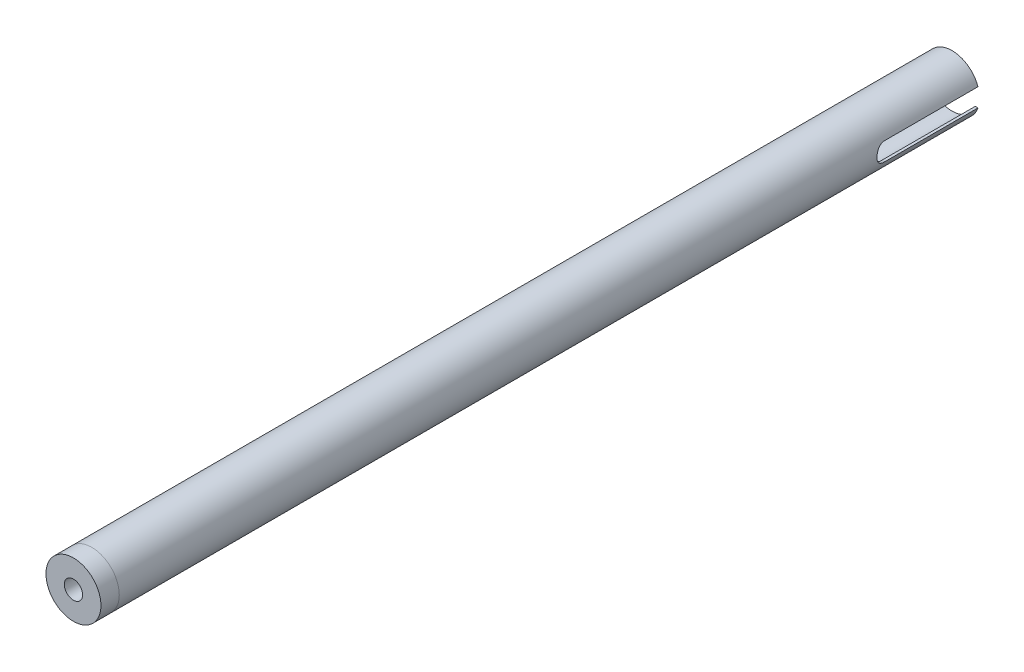
ISO-10303-21;
HEADER;
FILE_DESCRIPTION(('STEP AP214'),'2;1');
FILE_NAME('part.step','',(''),(''),'','','');
FILE_SCHEMA(('AUTOMOTIVE_DESIGN { 1 0 10303 214 1 1 1 1 }'));
ENDSEC;
DATA;
#1=APPLICATION_CONTEXT('core data for automotive mechanical design processes');
#2=APPLICATION_PROTOCOL_DEFINITION('international standard','automotive_design',2000,#1);
#3=PRODUCT_CONTEXT('',#1,'mechanical');
#4=PRODUCT('Part','Part','',(#3));
#5=PRODUCT_RELATED_PRODUCT_CATEGORY('part','',(#4));
#6=PRODUCT_DEFINITION_FORMATION('','',#4);
#7=PRODUCT_DEFINITION_CONTEXT('part definition',#1,'design');
#8=PRODUCT_DEFINITION('design','',#6,#7);
#9=PRODUCT_DEFINITION_SHAPE('','',#8);
#10=(LENGTH_UNIT() NAMED_UNIT(*) SI_UNIT(.MILLI.,.METRE.));
#11=(NAMED_UNIT(*) PLANE_ANGLE_UNIT() SI_UNIT($,.RADIAN.));
#12=(NAMED_UNIT(*) SI_UNIT($,.STERADIAN.) SOLID_ANGLE_UNIT());
#13=UNCERTAINTY_MEASURE_WITH_UNIT(LENGTH_MEASURE(1.E-05),#10,'distance_accuracy_value','');
#14=(GEOMETRIC_REPRESENTATION_CONTEXT(3) GLOBAL_UNCERTAINTY_ASSIGNED_CONTEXT((#13)) GLOBAL_UNIT_ASSIGNED_CONTEXT((#10,
#11,#12)) REPRESENTATION_CONTEXT('',''));
#15=CARTESIAN_POINT('',(0.,0.,0.));
#16=DIRECTION('',(0.,0.,1.));
#17=DIRECTION('',(1.,0.,0.));
#18=AXIS2_PLACEMENT_3D('',#15,#16,#17);
#19=CARTESIAN_POINT('',(0.,0.,-304.380065838685));
#20=DIRECTION('',(0.,0.,1.));
#21=DIRECTION('',(1.,0.,0.));
#22=AXIS2_PLACEMENT_3D('',#19,#20,#21);
#23=CYLINDRICAL_SURFACE('',#22,9.525);
#24=CARTESIAN_POINT('',(0.,0.,-6.35));
#25=DIRECTION('',(0.,0.,1.));
#26=DIRECTION('',(1.,0.,0.));
#27=AXIS2_PLACEMENT_3D('',#24,#25,#26);
#28=CIRCLE('',#27,9.525);
#29=CARTESIAN_POINT('',(9.525,0.,-6.35));
#30=VERTEX_POINT('',#29);
#31=EDGE_CURVE('E167',#30,#30,#28,.T.);
#32=ORIENTED_EDGE('',*,*,#31,.F.);
#33=EDGE_LOOP('',(#32));
#34=FACE_BOUND('',#33,.T.);
#35=CARTESIAN_POINT('',(-8.98025612106915,3.175,-271.995065838685));
#36=CARTESIAN_POINT('',(-8.98024230233901,3.17501142134308,-271.908439735349));
#37=CARTESIAN_POINT('',(-8.98150922759707,3.17145501317748,-271.821821352873));
#38=CARTESIAN_POINT('',(-8.98650170400112,3.1572955094353,-271.649256538048));
#39=CARTESIAN_POINT('',(-8.99022659113085,3.14669431699564,-271.563309930562));
#40=CARTESIAN_POINT('',(-9.00001740508998,3.11857670914845,-271.392955689397));
#41=CARTESIAN_POINT('',(-9.00607621805003,3.10108130380328,-271.30854418759));
#42=CARTESIAN_POINT('',(-9.02033586435304,3.05935434973543,-271.141609386254));
#43=CARTESIAN_POINT('',(-9.02853677497232,3.03512255799513,-271.059086154963));
#44=CARTESIAN_POINT('',(-9.05598792154067,2.95264369348964,-270.815287531686));
#45=CARTESIAN_POINT('',(-9.07810200713862,2.88457148458964,-270.657533947362));
#46=CARTESIAN_POINT('',(-9.127451360236,2.72437908867648,-270.355657428873));
#47=CARTESIAN_POINT('',(-9.15468995097455,2.63224328129309,-270.211543431645));
#48=CARTESIAN_POINT('',(-9.21240416673121,2.42269155952415,-269.93539057182));
#49=CARTESIAN_POINT('',(-9.24296008478943,2.30449853156514,-269.803956989958));
#50=CARTESIAN_POINT('',(-9.30318902123142,2.04784031127147,-269.562361693621));
#51=CARTESIAN_POINT('',(-9.33286185998227,1.90937102786997,-269.452204282389));
#52=CARTESIAN_POINT('',(-9.38892492365177,1.61159672697581,-269.253487270901));
#53=CARTESIAN_POINT('',(-9.41520772598946,1.45183792838573,-269.165575084891));
#54=CARTESIAN_POINT('',(-9.46054712430068,1.11883883316166,-269.018170358821));
#55=CARTESIAN_POINT('',(-9.47961052807859,0.945611424033788,-268.95865103082));
#56=CARTESIAN_POINT('',(-9.50410661247238,0.642992499572375,-268.883172266324));
#57=CARTESIAN_POINT('',(-9.51189798251809,0.515662964136016,-268.859554294281));
#58=CARTESIAN_POINT('',(-9.51973491912187,0.323120458247701,-268.835888028107));
#59=CARTESIAN_POINT('',(-9.52170555244691,0.258670486244991,-268.829959380491));
#60=CARTESIAN_POINT('',(-9.52433958502699,0.12948493034666,-268.822046755824));
#61=CARTESIAN_POINT('',(-9.5250026318504,0.0647492741617728,-268.820063842259));
#62=CARTESIAN_POINT('',(-9.525,0.,-268.820065838685));
#63=B_SPLINE_CURVE_WITH_KNOTS('',3,(#35,#36,#37,#38,#39,#40,#41,#42,#43,#44,#45,#46,#47,#48,#49,
#50,#51,#52,#53,#54,#55,#56,#57,#58,#59,#60,#61,#62),.UNSPECIFIED.,.F.,.F.,(4,2,2,2,2,2,2,2,2,2,
2,2,2,4),(0.,0.259783027985017,0.519495904525443,0.778423354079467,1.0373601457496,
1.55448370709133,2.07194378605916,2.60765740005743,3.14347925237348,3.69345572792671,
4.24291228331228,4.63105001394513,4.82518498412947,5.01937227204625),.UNSPECIFIED.);
#64=CARTESIAN_POINT('',(-8.98025612106915,3.175,-271.995065838685));
#65=VERTEX_POINT('',#64);
#66=CARTESIAN_POINT('',(-9.525,0.,-268.820065838685));
#67=VERTEX_POINT('',#66);
#68=EDGE_CURVE('E194',#65,#67,#63,.T.);
#69=ORIENTED_EDGE('',*,*,#68,.T.);
#70=CARTESIAN_POINT('',(-9.525,0.,-268.820065838685));
#71=CARTESIAN_POINT('',(-9.52501110102584,-0.0867614879611049,-268.820054733648));
#72=CARTESIAN_POINT('',(-9.52381482114642,-0.173516026970688,-268.823621945305));
#73=CARTESIAN_POINT('',(-9.51909010104991,-0.346361025979108,-268.837826783887));
#74=CARTESIAN_POINT('',(-9.51556219632442,-0.432451633867625,-268.848462787364));
#75=CARTESIAN_POINT('',(-9.50626969526085,-0.603121388983434,-268.876679778878));
#76=CARTESIAN_POINT('',(-9.50051134567603,-0.687704073408645,-268.894241373046));
#77=CARTESIAN_POINT('',(-9.48692170416637,-0.854983898510573,-268.936132693684));
#78=CARTESIAN_POINT('',(-9.47909035815865,-0.937680989932473,-268.960462596734));
#79=CARTESIAN_POINT('',(-9.45278540829331,-1.18202731628102,-269.043296989672));
#80=CARTESIAN_POINT('',(-9.43148823554423,-1.3401498669332,-269.111682671018));
#81=CARTESIAN_POINT('',(-9.38354405256208,-1.64264414222568,-269.272609196794));
#82=CARTESIAN_POINT('',(-9.35689419571071,-1.78700848960572,-269.365162901948));
#83=CARTESIAN_POINT('',(-9.30002401422067,-2.06291632995428,-269.575156330153));
#84=CARTESIAN_POINT('',(-9.26971861159363,-2.19392359690275,-269.693278615572));
#85=CARTESIAN_POINT('',(-9.20941732427212,-2.43468689521899,-269.949616592407));
#86=CARTESIAN_POINT('',(-9.1794215361322,-2.54443647619593,-270.087838360565));
#87=CARTESIAN_POINT('',(-9.122187697517,-2.74268087840455,-270.385346339613));
#88=CARTESIAN_POINT('',(-9.09505529775998,-2.83046425019681,-270.545128477686));
#89=CARTESIAN_POINT('',(-9.04794936227173,-2.9776233718293,-270.878172799691));
#90=CARTESIAN_POINT('',(-9.0279682579705,-3.03702917747985,-271.051420494499));
#91=CARTESIAN_POINT('',(-9.00226999890487,-3.1122125650425,-271.353707528494));
#92=CARTESIAN_POINT('',(-8.99408207355733,-3.13569679171672,-271.480669849921));
#93=CARTESIAN_POINT('',(-8.98304472933549,-3.16711304593222,-271.73674702169));
#94=CARTESIAN_POINT('',(-8.98019613476149,-3.17504267212105,-271.865862201292));
#95=CARTESIAN_POINT('',(-8.98025612106915,-3.175,-271.995065838685));
#96=B_SPLINE_CURVE_WITH_KNOTS('',3,(#70,#71,#72,#73,#74,#75,#76,#77,#78,#79,#80,#81,#82,#83,#84,
#85,#86,#87,#88,#89,#90,#91,#92,#93,#94,#95),.UNSPECIFIED.,.F.,.F.,(4,2,2,2,2,2,2,2,2,2,2,2,4),
(0.,0.260191091827307,0.52032244773723,0.77973046721251,1.03914525511038,1.55731822615721,
2.07576750062865,2.61028978360824,3.14497400776474,3.6952175213376,4.24487695078963,
4.63199348452988,5.01916977744542),.UNSPECIFIED.);
#97=CARTESIAN_POINT('',(-8.98025612106916,-3.175,-271.995065838685));
#98=VERTEX_POINT('',#97);
#99=EDGE_CURVE('E146',#67,#98,#96,.T.);
#100=ORIENTED_EDGE('',*,*,#99,.T.);
#101=DIRECTION('',(0.,0.,-1.));
#102=VECTOR('',#101,1.);
#103=CARTESIAN_POINT('',(-8.98025612106916,-3.175,-268.820065838685));
#104=LINE('',#103,#102);
#105=CARTESIAN_POINT('',(-8.98025612106916,-3.175,-304.380065838685));
#106=VERTEX_POINT('',#105);
#107=EDGE_CURVE('E141',#98,#106,#104,.T.);
#108=ORIENTED_EDGE('',*,*,#107,.T.);
#109=CARTESIAN_POINT('',(0.,0.,-304.380065838685));
#110=DIRECTION('',(0.,0.,1.));
#111=DIRECTION('',(1.,0.,0.));
#112=AXIS2_PLACEMENT_3D('',#109,#110,#111);
#113=CIRCLE('',#112,9.525);
#114=CARTESIAN_POINT('',(8.98025612106915,-3.175,-304.380065838685));
#115=VERTEX_POINT('',#114);
#116=EDGE_CURVE('E144',#106,#115,#113,.T.);
#117=ORIENTED_EDGE('',*,*,#116,.T.);
#118=DIRECTION('',(0.,0.,-1.));
#119=VECTOR('',#118,1.);
#120=CARTESIAN_POINT('',(8.98025612106915,-3.175,-268.820065838685));
#121=LINE('',#120,#119);
#122=CARTESIAN_POINT('',(8.98025612106915,-3.175,-271.995065838685));
#123=VERTEX_POINT('',#122);
#124=EDGE_CURVE('E427',#123,#115,#121,.T.);
#125=ORIENTED_EDGE('',*,*,#124,.F.);
#126=CARTESIAN_POINT('',(8.98025612106915,-3.175,-271.995065838685));
#127=CARTESIAN_POINT('',(8.98024230233901,-3.17501142134308,-271.908439735349));
#128=CARTESIAN_POINT('',(8.98150922759707,-3.17145501317748,-271.821821352873));
#129=CARTESIAN_POINT('',(8.98650170400112,-3.1572955094353,-271.649256538048));
#130=CARTESIAN_POINT('',(8.99022659113085,-3.14669431699564,-271.563309930562));
#131=CARTESIAN_POINT('',(9.00001740508998,-3.11857670914845,-271.392955689397));
#132=CARTESIAN_POINT('',(9.00607621805003,-3.10108130380328,-271.30854418759));
#133=CARTESIAN_POINT('',(9.02033586435304,-3.05935434973543,-271.141609386254));
#134=CARTESIAN_POINT('',(9.02853677497232,-3.03512255799513,-271.059086154963));
#135=CARTESIAN_POINT('',(9.05598792154067,-2.95264369348964,-270.815287531686));
#136=CARTESIAN_POINT('',(9.07810200713862,-2.88457148458964,-270.657533947362));
#137=CARTESIAN_POINT('',(9.127451360236,-2.72437908867648,-270.355657428873));
#138=CARTESIAN_POINT('',(9.15468995097455,-2.63224328129309,-270.211543431645));
#139=CARTESIAN_POINT('',(9.21240416673121,-2.42269155952415,-269.93539057182));
#140=CARTESIAN_POINT('',(9.24296008478943,-2.30449853156514,-269.803956989958));
#141=CARTESIAN_POINT('',(9.30318902123142,-2.04784031127147,-269.562361693621));
#142=CARTESIAN_POINT('',(9.33286185998227,-1.90937102786997,-269.452204282389));
#143=CARTESIAN_POINT('',(9.38892492365177,-1.61159672697581,-269.253487270901));
#144=CARTESIAN_POINT('',(9.41520772598946,-1.45183792838573,-269.165575084891));
#145=CARTESIAN_POINT('',(9.46054712430068,-1.11883883316166,-269.018170358821));
#146=CARTESIAN_POINT('',(9.47961052807859,-0.945611424033788,-268.95865103082));
#147=CARTESIAN_POINT('',(9.50410661247238,-0.642992499572375,-268.883172266324));
#148=CARTESIAN_POINT('',(9.51189798251809,-0.515662964136016,-268.859554294281));
#149=CARTESIAN_POINT('',(9.51973491912187,-0.323120458247701,-268.835888028107));
#150=CARTESIAN_POINT('',(9.52170555244691,-0.258670486244991,-268.829959380491));
#151=CARTESIAN_POINT('',(9.52433958502699,-0.12948493034666,-268.822046755824));
#152=CARTESIAN_POINT('',(9.5250026318504,-0.0647492741617728,-268.820063842259));
#153=CARTESIAN_POINT('',(9.525,0.,-268.820065838685));
#154=B_SPLINE_CURVE_WITH_KNOTS('',3,(#126,#127,#128,#129,#130,#131,#132,#133,#134,#135,#136,
#137,#138,#139,#140,#141,#142,#143,#144,#145,#146,#147,#148,#149,#150,#151,#152,#153),
.UNSPECIFIED.,.F.,.F.,(4,2,2,2,2,2,2,2,2,2,2,2,2,4),(0.,0.259783027985017,0.519495904525443,
0.778423354079467,1.0373601457496,1.55448370709133,2.07194378605916,2.60765740005743,
3.14347925237348,3.69345572792671,4.24291228331228,4.63105001394513,4.82518498412947,
5.01937227204625),.UNSPECIFIED.);
#155=CARTESIAN_POINT('',(9.525,0.,-268.820065838685));
#156=VERTEX_POINT('',#155);
#157=EDGE_CURVE('E87',#123,#156,#154,.T.);
#158=ORIENTED_EDGE('',*,*,#157,.T.);
#159=CARTESIAN_POINT('',(9.525,0.,-268.820065838685));
#160=CARTESIAN_POINT('',(9.52501110102584,0.0867614879611049,-268.820054733648));
#161=CARTESIAN_POINT('',(9.52381482114642,0.173516026970688,-268.823621945305));
#162=CARTESIAN_POINT('',(9.51909010104991,0.346361025979108,-268.837826783887));
#163=CARTESIAN_POINT('',(9.51556219632442,0.432451633867625,-268.848462787364));
#164=CARTESIAN_POINT('',(9.50626969526085,0.603121388983434,-268.876679778878));
#165=CARTESIAN_POINT('',(9.50051134567603,0.687704073408645,-268.894241373046));
#166=CARTESIAN_POINT('',(9.48692170416637,0.854983898510573,-268.936132693684));
#167=CARTESIAN_POINT('',(9.47909035815865,0.937680989932473,-268.960462596734));
#168=CARTESIAN_POINT('',(9.45278540829331,1.18202731628102,-269.043296989672));
#169=CARTESIAN_POINT('',(9.43148823554423,1.3401498669332,-269.111682671018));
#170=CARTESIAN_POINT('',(9.38354405256208,1.64264414222568,-269.272609196794));
#171=CARTESIAN_POINT('',(9.35689419571071,1.78700848960572,-269.365162901948));
#172=CARTESIAN_POINT('',(9.30002401422067,2.06291632995428,-269.575156330153));
#173=CARTESIAN_POINT('',(9.26971861159363,2.19392359690275,-269.693278615572));
#174=CARTESIAN_POINT('',(9.20941732427212,2.43468689521899,-269.949616592407));
#175=CARTESIAN_POINT('',(9.1794215361322,2.54443647619593,-270.087838360565));
#176=CARTESIAN_POINT('',(9.122187697517,2.74268087840455,-270.385346339613));
#177=CARTESIAN_POINT('',(9.09505529775998,2.83046425019681,-270.545128477686));
#178=CARTESIAN_POINT('',(9.04794936227173,2.9776233718293,-270.878172799691));
#179=CARTESIAN_POINT('',(9.0279682579705,3.03702917747985,-271.051420494499));
#180=CARTESIAN_POINT('',(9.00226999890487,3.1122125650425,-271.353707528494));
#181=CARTESIAN_POINT('',(8.99408207355733,3.13569679171672,-271.480669849921));
#182=CARTESIAN_POINT('',(8.98304472933549,3.16711304593222,-271.73674702169));
#183=CARTESIAN_POINT('',(8.98019613476149,3.17504267212105,-271.865862201292));
#184=CARTESIAN_POINT('',(8.98025612106915,3.175,-271.995065838685));
#185=B_SPLINE_CURVE_WITH_KNOTS('',3,(#159,#160,#161,#162,#163,#164,#165,#166,#167,#168,#169,
#170,#171,#172,#173,#174,#175,#176,#177,#178,#179,#180,#181,#182,#183,#184),.UNSPECIFIED.,.F.,
.F.,(4,2,2,2,2,2,2,2,2,2,2,2,4),(0.,0.260191091827307,0.52032244773723,0.77973046721251,
1.03914525511038,1.55731822615721,2.07576750062865,2.61028978360824,3.14497400776474,
3.6952175213376,4.24487695078963,4.63199348452988,5.01916977744542),.UNSPECIFIED.);
#186=CARTESIAN_POINT('',(8.98025612106915,3.175,-271.995065838685));
#187=VERTEX_POINT('',#186);
#188=EDGE_CURVE('E73',#156,#187,#185,.T.);
#189=ORIENTED_EDGE('',*,*,#188,.T.);
#190=DIRECTION('',(0.,0.,-1.));
#191=VECTOR('',#190,1.);
#192=CARTESIAN_POINT('',(8.98025612106915,3.175,-268.820065838685));
#193=LINE('',#192,#191);
#194=CARTESIAN_POINT('',(8.98025612106915,3.175,-304.380065838685));
#195=VERTEX_POINT('',#194);
#196=EDGE_CURVE('E160',#187,#195,#193,.T.);
#197=ORIENTED_EDGE('',*,*,#196,.T.);
#198=CARTESIAN_POINT('',(-8.98025612106915,3.175,-304.380065838685));
#199=VERTEX_POINT('',#198);
#200=EDGE_CURVE('E166',#195,#199,#113,.T.);
#201=ORIENTED_EDGE('',*,*,#200,.T.);
#202=DIRECTION('',(0.,0.,-1.));
#203=VECTOR('',#202,1.);
#204=CARTESIAN_POINT('',(-8.98025612106915,3.175,-268.820065838685));
#205=LINE('',#204,#203);
#206=EDGE_CURVE('E420',#65,#199,#205,.T.);
#207=ORIENTED_EDGE('',*,*,#206,.F.);
#208=EDGE_LOOP('',(#69,#100,#108,#117,#125,#158,#189,#197,#201,#207));
#209=FACE_BOUND('',#208,.T.);
#210=ADVANCED_FACE('F63',(#34,#209),#23,.T.);
#211=CARTESIAN_POINT('',(0.,0.,-304.380065838685));
#212=DIRECTION('',(0.,0.,1.));
#213=DIRECTION('',(1.,0.,0.));
#214=AXIS2_PLACEMENT_3D('',#211,#212,#213);
#215=PLANE('',#214);
#216=DIRECTION('',(1.,0.,0.));
#217=VECTOR('',#216,1.);
#218=CARTESIAN_POINT('',(0.,-3.175,-304.380065838685));
#219=LINE('',#218,#217);
#220=CARTESIAN_POINT('',(-8.03118117091129,-3.175,-304.380065838685));
#221=VERTEX_POINT('',#220);
#222=EDGE_CURVE('E153',#106,#221,#219,.T.);
#223=ORIENTED_EDGE('',*,*,#222,.T.);
#224=CARTESIAN_POINT('',(0.,0.,-304.380065838685));
#225=DIRECTION('',(0.,0.,1.));
#226=DIRECTION('',(1.,0.,0.));
#227=AXIS2_PLACEMENT_3D('',#224,#225,#226);
#228=CIRCLE('',#227,8.636);
#229=CARTESIAN_POINT('',(8.03118117091129,-3.175,-304.380065838685));
#230=VERTEX_POINT('',#229);
#231=EDGE_CURVE('E275',#221,#230,#228,.T.);
#232=ORIENTED_EDGE('',*,*,#231,.T.);
#233=DIRECTION('',(1.,0.,0.));
#234=VECTOR('',#233,1.);
#235=CARTESIAN_POINT('',(0.,-3.175,-304.380065838685));
#236=LINE('',#235,#234);
#237=EDGE_CURVE('E165',#230,#115,#236,.T.);
#238=ORIENTED_EDGE('',*,*,#237,.T.);
#239=ORIENTED_EDGE('',*,*,#116,.F.);
#240=EDGE_LOOP('',(#223,#232,#238,#239));
#241=FACE_BOUND('',#240,.T.);
#242=ADVANCED_FACE('F163',(#241),#215,.F.);
#243=CARTESIAN_POINT('',(0.,0.,-304.380065838685));
#244=DIRECTION('',(0.,0.,1.));
#245=DIRECTION('',(1.,0.,0.));
#246=AXIS2_PLACEMENT_3D('',#243,#244,#245);
#247=CYLINDRICAL_SURFACE('',#246,8.636);
#248=CARTESIAN_POINT('',(0.,0.,-6.35));
#249=DIRECTION('',(0.,0.,1.));
#250=DIRECTION('',(1.,0.,0.));
#251=AXIS2_PLACEMENT_3D('',#248,#249,#250);
#252=CIRCLE('',#251,8.636);
#253=CARTESIAN_POINT('',(8.636,0.,-6.35));
#254=VERTEX_POINT('',#253);
#255=EDGE_CURVE('E149',#254,#254,#252,.T.);
#256=ORIENTED_EDGE('',*,*,#255,.T.);
#257=EDGE_LOOP('',(#256));
#258=FACE_BOUND('',#257,.T.);
#259=DIRECTION('',(0.,0.,-1.));
#260=VECTOR('',#259,1.);
#261=CARTESIAN_POINT('',(-8.03118117091129,-3.175,-268.820065838685));
#262=LINE('',#261,#260);
#263=CARTESIAN_POINT('',(-8.03118117091129,-3.175,-271.995065838685));
#264=VERTEX_POINT('',#263);
#265=EDGE_CURVE('E150',#264,#221,#262,.T.);
#266=ORIENTED_EDGE('',*,*,#265,.F.);
#267=CARTESIAN_POINT('',(-8.03118117091129,-3.175,-271.995065838685));
#268=CARTESIAN_POINT('',(-8.03116550357192,-3.17501203663229,-271.909030870569));
#269=CARTESIAN_POINT('',(-8.03256328665432,-3.17150327993899,-271.82300451804));
#270=CARTESIAN_POINT('',(-8.03806891362409,-3.15753809299539,-271.651631947571));
#271=CARTESIAN_POINT('',(-8.04217588089716,-3.14708391007799,-271.566285518665));
#272=CARTESIAN_POINT('',(-8.05296421917626,-3.11937037021479,-271.39717638445));
#273=CARTESIAN_POINT('',(-8.05963650808001,-3.10213501593152,-271.313409173507));
#274=CARTESIAN_POINT('',(-8.07533202922414,-3.06104389654164,-271.147760210739));
#275=CARTESIAN_POINT('',(-8.08435537430867,-3.0371878136549,-271.06587854962));
#276=CARTESIAN_POINT('',(-8.11453837074661,-2.95603278100127,-270.824026392375));
#277=CARTESIAN_POINT('',(-8.13883087950844,-2.88909903597752,-270.6675597548));
#278=CARTESIAN_POINT('',(-8.19300406693486,-2.73167948818753,-270.368024765675));
#279=CARTESIAN_POINT('',(-8.22288931448619,-2.64117440539563,-270.224967513118));
#280=CARTESIAN_POINT('',(-8.28646461334555,-2.43457537576576,-269.94949710388));
#281=CARTESIAN_POINT('',(-8.32026315150129,-2.317546455696,-269.817808731793));
#282=CARTESIAN_POINT('',(-8.38695072719909,-2.06320558041454,-269.5754205534));
#283=CARTESIAN_POINT('',(-8.41983956911545,-1.9258893021522,-269.464725232029));
#284=CARTESIAN_POINT('',(-8.48230406273647,-1.62932475427477,-269.263944117079));
#285=CARTESIAN_POINT('',(-8.5117351959247,-1.46950375402868,-269.174655763574));
#286=CARTESIAN_POINT('',(-8.56262575627031,-1.13591027783605,-269.02459361061));
#287=CARTESIAN_POINT('',(-8.58409342507971,-0.962152453429211,-268.96379031379));
#288=CARTESIAN_POINT('',(-8.61197450421744,-0.656412542712579,-268.88586594814));
#289=CARTESIAN_POINT('',(-8.62092967235125,-0.526538210349253,-268.861250163802));
#290=CARTESIAN_POINT('',(-8.62994176115801,-0.33002097693851,-268.836572832086));
#291=CARTESIAN_POINT('',(-8.63220903333296,-0.264206342476355,-268.830388092936));
#292=CARTESIAN_POINT('',(-8.63523992352765,-0.132266265743979,-268.82213287749));
#293=CARTESIAN_POINT('',(-8.6360031097792,-0.0661407396870706,-268.820063582587));
#294=CARTESIAN_POINT('',(-8.636,0.,-268.820065838685));
#295=B_SPLINE_CURVE_WITH_KNOTS('',3,(#267,#268,#269,#270,#271,#272,#273,#274,#275,#276,#277,
#278,#279,#280,#281,#282,#283,#284,#285,#286,#287,#288,#289,#290,#291,#292,#293,#294),
.UNSPECIFIED.,.F.,.F.,(4,2,2,2,2,2,2,2,2,2,2,2,2,4),(0.,0.258007583993629,0.515931725057005,
0.77295101340558,1.02998264023838,1.54317615093284,2.05679075055082,2.59254838663378,
3.128420352877,3.6819142239817,4.23483365719865,4.63113823379683,4.82943692106888,
5.02779252437178),.UNSPECIFIED.);
#296=CARTESIAN_POINT('',(-8.636,0.,-268.820065838685));
#297=VERTEX_POINT('',#296);
#298=EDGE_CURVE('E221',#264,#297,#295,.T.);
#299=ORIENTED_EDGE('',*,*,#298,.T.);
#300=CARTESIAN_POINT('',(-8.636,0.,-268.820065838685));
#301=CARTESIAN_POINT('',(-8.63601200177566,0.0862340545028663,-268.820054264962));
#302=CARTESIAN_POINT('',(-8.63470866649585,0.172460638964016,-268.823578804982));
#303=CARTESIAN_POINT('',(-8.62956076290727,0.344245368623961,-268.837610234612));
#304=CARTESIAN_POINT('',(-8.62571686385256,0.429803683858972,-268.848115285368));
#305=CARTESIAN_POINT('',(-8.61559314175803,0.599377201936824,-268.875974039423));
#306=CARTESIAN_POINT('',(-8.60932102288695,0.683396413719317,-268.893306085279));
#307=CARTESIAN_POINT('',(-8.5945171663722,0.849553539449469,-268.934637308555));
#308=CARTESIAN_POINT('',(-8.58598535382315,0.93169139093483,-268.958636706988));
#309=CARTESIAN_POINT('',(-8.55732464851214,1.17435074221828,-269.040310888426));
#310=CARTESIAN_POINT('',(-8.53411500636261,1.33136171263578,-269.107702209392));
#311=CARTESIAN_POINT('',(-8.48180653117632,1.63181198358795,-269.266193919402));
#312=CARTESIAN_POINT('',(-8.45270389942466,1.77524244193608,-269.357309612439));
#313=CARTESIAN_POINT('',(-8.39029834803106,2.05036661398532,-269.564562730117));
#314=CARTESIAN_POINT('',(-8.35688032192871,2.1814347411356,-269.681497097709));
#315=CARTESIAN_POINT('',(-8.29018507770489,2.42260670191496,-269.935386084166));
#316=CARTESIAN_POINT('',(-8.25690791509208,2.53270290926749,-270.072347953996));
#317=CARTESIAN_POINT('',(-8.19291826363247,2.73277128594141,-270.368513042821));
#318=CARTESIAN_POINT('',(-8.16234475412034,2.82185641770732,-270.528348132258));
#319=CARTESIAN_POINT('',(-8.10906121054024,2.97153048258984,-270.86194347576));
#320=CARTESIAN_POINT('',(-8.08634169503735,3.03215380703845,-271.035686625429));
#321=CARTESIAN_POINT('',(-8.05677760160867,3.10966172606007,-271.340955260242));
#322=CARTESIAN_POINT('',(-8.04725077861386,3.13409804308655,-271.470335979448));
#323=CARTESIAN_POINT('',(-8.03764862425496,3.15860280233702,-271.666143105288));
#324=CARTESIAN_POINT('',(-8.0352292163598,3.16474613160121,-271.731735861594));
#325=CARTESIAN_POINT('',(-8.03199317651195,3.17294655384153,-271.863235813984));
#326=CARTESIAN_POINT('',(-8.03117703985816,3.17500238406813,-271.929143100934));
#327=CARTESIAN_POINT('',(-8.03118117091129,3.175,-271.995065838685));
#328=B_SPLINE_CURVE_WITH_KNOTS('',3,(#300,#301,#302,#303,#304,#305,#306,#307,#308,#309,#310,
#311,#312,#313,#314,#315,#316,#317,#318,#319,#320,#321,#322,#323,#324,#325,#326,#327),
.UNSPECIFIED.,.F.,.F.,(4,2,2,2,2,2,2,2,2,2,2,2,2,4),(0.,0.25860768427724,0.517147271349144,
0.774873208333403,1.03260768960759,1.54734347080468,2.06241212125685,2.59642224394461,
3.13062618611955,3.6844391606936,4.23758121159796,4.63245186558862,4.83009172977028,
5.0277926412787),.UNSPECIFIED.);
#329=CARTESIAN_POINT('',(-8.03118117091129,3.175,-271.995065838685));
#330=VERTEX_POINT('',#329);
#331=EDGE_CURVE('E186',#297,#330,#328,.T.);
#332=ORIENTED_EDGE('',*,*,#331,.T.);
#333=DIRECTION('',(0.,0.,-1.));
#334=VECTOR('',#333,1.);
#335=CARTESIAN_POINT('',(-8.03118117091129,3.175,-268.820065838685));
#336=LINE('',#335,#334);
#337=CARTESIAN_POINT('',(-8.03118117091129,3.175,-304.380065838685));
#338=VERTEX_POINT('',#337);
#339=EDGE_CURVE('E417',#330,#338,#336,.T.);
#340=ORIENTED_EDGE('',*,*,#339,.T.);
#341=CARTESIAN_POINT('',(8.03118117091129,3.175,-304.380065838685));
#342=VERTEX_POINT('',#341);
#343=EDGE_CURVE('E172',#342,#338,#228,.T.);
#344=ORIENTED_EDGE('',*,*,#343,.F.);
#345=DIRECTION('',(0.,0.,-1.));
#346=VECTOR('',#345,1.);
#347=CARTESIAN_POINT('',(8.03118117091129,3.175,-268.820065838685));
#348=LINE('',#347,#346);
#349=CARTESIAN_POINT('',(8.03118117091129,3.175,-271.995065838685));
#350=VERTEX_POINT('',#349);
#351=EDGE_CURVE('E269',#350,#342,#348,.T.);
#352=ORIENTED_EDGE('',*,*,#351,.F.);
#353=CARTESIAN_POINT('',(8.03118117091129,3.175,-271.995065838685));
#354=CARTESIAN_POINT('',(8.03116550357192,3.17501203663229,-271.909030870569));
#355=CARTESIAN_POINT('',(8.03256328665432,3.17150327993899,-271.82300451804));
#356=CARTESIAN_POINT('',(8.03806891362409,3.15753809299539,-271.651631947571));
#357=CARTESIAN_POINT('',(8.04217588089716,3.14708391007799,-271.566285518665));
#358=CARTESIAN_POINT('',(8.05296421917626,3.11937037021479,-271.39717638445));
#359=CARTESIAN_POINT('',(8.05963650808001,3.10213501593152,-271.313409173507));
#360=CARTESIAN_POINT('',(8.07533202922414,3.06104389654164,-271.147760210739));
#361=CARTESIAN_POINT('',(8.08435537430867,3.0371878136549,-271.06587854962));
#362=CARTESIAN_POINT('',(8.11453837074661,2.95603278100127,-270.824026392375));
#363=CARTESIAN_POINT('',(8.13883087950844,2.88909903597752,-270.6675597548));
#364=CARTESIAN_POINT('',(8.19300406693486,2.73167948818753,-270.368024765675));
#365=CARTESIAN_POINT('',(8.22288931448619,2.64117440539563,-270.224967513118));
#366=CARTESIAN_POINT('',(8.28646461334555,2.43457537576576,-269.94949710388));
#367=CARTESIAN_POINT('',(8.32026315150129,2.317546455696,-269.817808731793));
#368=CARTESIAN_POINT('',(8.38695072719909,2.06320558041454,-269.5754205534));
#369=CARTESIAN_POINT('',(8.41983956911545,1.9258893021522,-269.464725232029));
#370=CARTESIAN_POINT('',(8.48230406273647,1.62932475427477,-269.263944117079));
#371=CARTESIAN_POINT('',(8.5117351959247,1.46950375402868,-269.174655763574));
#372=CARTESIAN_POINT('',(8.56262575627031,1.13591027783605,-269.02459361061));
#373=CARTESIAN_POINT('',(8.58409342507971,0.962152453429211,-268.96379031379));
#374=CARTESIAN_POINT('',(8.61197450421744,0.656412542712579,-268.88586594814));
#375=CARTESIAN_POINT('',(8.62092967235125,0.526538210349253,-268.861250163802));
#376=CARTESIAN_POINT('',(8.62994176115801,0.33002097693851,-268.836572832086));
#377=CARTESIAN_POINT('',(8.63220903333296,0.264206342476355,-268.830388092936));
#378=CARTESIAN_POINT('',(8.63523992352765,0.132266265743979,-268.82213287749));
#379=CARTESIAN_POINT('',(8.6360031097792,0.0661407396870706,-268.820063582587));
#380=CARTESIAN_POINT('',(8.636,0.,-268.820065838685));
#381=B_SPLINE_CURVE_WITH_KNOTS('',3,(#353,#354,#355,#356,#357,#358,#359,#360,#361,#362,#363,
#364,#365,#366,#367,#368,#369,#370,#371,#372,#373,#374,#375,#376,#377,#378,#379,#380),
.UNSPECIFIED.,.F.,.F.,(4,2,2,2,2,2,2,2,2,2,2,2,2,4),(0.,0.258007583993629,0.515931725057005,
0.77295101340558,1.02998264023838,1.54317615093284,2.05679075055082,2.59254838663378,
3.128420352877,3.6819142239817,4.23483365719865,4.63113823379683,4.82943692106888,
5.02779252437178),.UNSPECIFIED.);
#382=CARTESIAN_POINT('',(8.636,0.,-268.820065838685));
#383=VERTEX_POINT('',#382);
#384=EDGE_CURVE('E13',#350,#383,#381,.T.);
#385=ORIENTED_EDGE('',*,*,#384,.T.);
#386=CARTESIAN_POINT('',(8.636,0.,-268.820065838685));
#387=CARTESIAN_POINT('',(8.63601200177566,-0.0862340545028663,-268.820054264962));
#388=CARTESIAN_POINT('',(8.63470866649585,-0.172460638964016,-268.823578804982));
#389=CARTESIAN_POINT('',(8.62956076290727,-0.344245368623961,-268.837610234612));
#390=CARTESIAN_POINT('',(8.62571686385256,-0.429803683858972,-268.848115285368));
#391=CARTESIAN_POINT('',(8.61559314175803,-0.599377201936824,-268.875974039423));
#392=CARTESIAN_POINT('',(8.60932102288695,-0.683396413719317,-268.893306085279));
#393=CARTESIAN_POINT('',(8.5945171663722,-0.849553539449469,-268.934637308555));
#394=CARTESIAN_POINT('',(8.58598535382315,-0.93169139093483,-268.958636706988));
#395=CARTESIAN_POINT('',(8.55732464851214,-1.17435074221828,-269.040310888426));
#396=CARTESIAN_POINT('',(8.53411500636261,-1.33136171263578,-269.107702209392));
#397=CARTESIAN_POINT('',(8.48180653117632,-1.63181198358795,-269.266193919402));
#398=CARTESIAN_POINT('',(8.45270389942466,-1.77524244193608,-269.357309612439));
#399=CARTESIAN_POINT('',(8.39029834803106,-2.05036661398532,-269.564562730117));
#400=CARTESIAN_POINT('',(8.35688032192871,-2.1814347411356,-269.681497097709));
#401=CARTESIAN_POINT('',(8.29018507770489,-2.42260670191496,-269.935386084166));
#402=CARTESIAN_POINT('',(8.25690791509208,-2.53270290926749,-270.072347953996));
#403=CARTESIAN_POINT('',(8.19291826363247,-2.73277128594141,-270.368513042821));
#404=CARTESIAN_POINT('',(8.16234475412034,-2.82185641770732,-270.528348132258));
#405=CARTESIAN_POINT('',(8.10906121054024,-2.97153048258984,-270.86194347576));
#406=CARTESIAN_POINT('',(8.08634169503735,-3.03215380703845,-271.035686625429));
#407=CARTESIAN_POINT('',(8.05677760160867,-3.10966172606007,-271.340955260242));
#408=CARTESIAN_POINT('',(8.04725077861386,-3.13409804308655,-271.470335979448));
#409=CARTESIAN_POINT('',(8.03764862425496,-3.15860280233702,-271.666143105288));
#410=CARTESIAN_POINT('',(8.0352292163598,-3.16474613160121,-271.731735861594));
#411=CARTESIAN_POINT('',(8.03199317651195,-3.17294655384153,-271.863235813984));
#412=CARTESIAN_POINT('',(8.03117703985816,-3.17500238406813,-271.929143100934));
#413=CARTESIAN_POINT('',(8.03118117091129,-3.175,-271.995065838685));
#414=B_SPLINE_CURVE_WITH_KNOTS('',3,(#386,#387,#388,#389,#390,#391,#392,#393,#394,#395,#396,
#397,#398,#399,#400,#401,#402,#403,#404,#405,#406,#407,#408,#409,#410,#411,#412,#413),
.UNSPECIFIED.,.F.,.F.,(4,2,2,2,2,2,2,2,2,2,2,2,2,4),(0.,0.25860768427724,0.517147271349144,
0.774873208333403,1.03260768960759,1.54734347080468,2.06241212125685,2.59642224394461,
3.13062618611955,3.6844391606936,4.23758121159796,4.63245186558862,4.83009172977028,
5.0277926412787),.UNSPECIFIED.);
#415=CARTESIAN_POINT('',(8.03118117091129,-3.175,-271.995065838685));
#416=VERTEX_POINT('',#415);
#417=EDGE_CURVE('E237',#383,#416,#414,.T.);
#418=ORIENTED_EDGE('',*,*,#417,.T.);
#419=DIRECTION('',(0.,0.,-1.));
#420=VECTOR('',#419,1.);
#421=CARTESIAN_POINT('',(8.03118117091129,-3.175,-268.820065838685));
#422=LINE('',#421,#420);
#423=EDGE_CURVE('E271',#416,#230,#422,.T.);
#424=ORIENTED_EDGE('',*,*,#423,.T.);
#425=ORIENTED_EDGE('',*,*,#231,.F.);
#426=EDGE_LOOP('',(#266,#299,#332,#340,#344,#352,#385,#418,#424,#425));
#427=FACE_BOUND('',#426,.T.);
#428=ADVANCED_FACE('F201',(#258,#427),#247,.F.);
#429=ORIENTED_EDGE('',*,*,#343,.T.);
#430=DIRECTION('',(1.,0.,0.));
#431=VECTOR('',#430,1.);
#432=CARTESIAN_POINT('',(0.,3.175,-304.380065838685));
#433=LINE('',#432,#431);
#434=EDGE_CURVE('E159',#199,#338,#433,.T.);
#435=ORIENTED_EDGE('',*,*,#434,.F.);
#436=ORIENTED_EDGE('',*,*,#200,.F.);
#437=DIRECTION('',(1.,0.,0.));
#438=VECTOR('',#437,1.);
#439=CARTESIAN_POINT('',(0.,3.175,-304.380065838685));
#440=LINE('',#439,#438);
#441=EDGE_CURVE('E253',#342,#195,#440,.T.);
#442=ORIENTED_EDGE('',*,*,#441,.F.);
#443=EDGE_LOOP('',(#429,#435,#436,#442));
#444=FACE_BOUND('',#443,.T.);
#445=ADVANCED_FACE('F286',(#444),#215,.F.);
#446=CARTESIAN_POINT('',(0.,0.,-6.35));
#447=DIRECTION('',(0.,0.,1.));
#448=DIRECTION('',(1.,0.,0.));
#449=AXIS2_PLACEMENT_3D('',#446,#447,#448);
#450=PLANE('',#449);
#451=ORIENTED_EDGE('',*,*,#255,.F.);
#452=EDGE_LOOP('',(#451));
#453=FACE_BOUND('',#452,.T.);
#454=ORIENTED_EDGE('',*,*,#31,.T.);
#455=EDGE_LOOP('',(#454));
#456=FACE_BOUND('',#455,.T.);
#457=ADVANCED_FACE('F283',(#453,#456),#450,.T.);
#458=CARTESIAN_POINT('',(0.,3.175,-268.820065838685));
#459=DIRECTION('',(0.,1.,0.));
#460=DIRECTION('',(0.,0.,1.));
#461=AXIS2_PLACEMENT_3D('',#458,#459,#460);
#462=PLANE('',#461);
#463=ORIENTED_EDGE('',*,*,#196,.F.);
#464=DIRECTION('',(1.,0.,0.));
#465=VECTOR('',#464,1.);
#466=CARTESIAN_POINT('',(8.03118117091129,3.175,-271.995065838685));
#467=LINE('',#466,#465);
#468=EDGE_CURVE('E184',#187,#350,#467,.F.);
#469=ORIENTED_EDGE('',*,*,#468,.T.);
#470=ORIENTED_EDGE('',*,*,#351,.T.);
#471=ORIENTED_EDGE('',*,*,#441,.T.);
#472=EDGE_LOOP('',(#463,#469,#470,#471));
#473=FACE_BOUND('',#472,.T.);
#474=ADVANCED_FACE('F266',(#473),#462,.F.);
#475=CARTESIAN_POINT('',(0.,-3.175,-268.820065838685));
#476=DIRECTION('',(0.,1.,0.));
#477=DIRECTION('',(0.,0.,1.));
#478=AXIS2_PLACEMENT_3D('',#475,#476,#477);
#479=PLANE('',#478);
#480=ORIENTED_EDGE('',*,*,#423,.F.);
#481=DIRECTION('',(1.,0.,0.));
#482=VECTOR('',#481,1.);
#483=CARTESIAN_POINT('',(0.,-3.175,-271.995065838685));
#484=LINE('',#483,#482);
#485=EDGE_CURVE('E181',#416,#123,#484,.T.);
#486=ORIENTED_EDGE('',*,*,#485,.T.);
#487=ORIENTED_EDGE('',*,*,#124,.T.);
#488=ORIENTED_EDGE('',*,*,#237,.F.);
#489=EDGE_LOOP('',(#480,#486,#487,#488));
#490=FACE_BOUND('',#489,.T.);
#491=ADVANCED_FACE('F361',(#490),#479,.T.);
#492=CARTESIAN_POINT('',(0.,-3.175,-268.820065838685));
#493=DIRECTION('',(0.,1.,0.));
#494=DIRECTION('',(0.,0.,1.));
#495=AXIS2_PLACEMENT_3D('',#492,#493,#494);
#496=PLANE('',#495);
#497=ORIENTED_EDGE('',*,*,#107,.F.);
#498=DIRECTION('',(1.,0.,0.));
#499=VECTOR('',#498,1.);
#500=CARTESIAN_POINT('',(0.,-3.175,-271.995065838685));
#501=LINE('',#500,#499);
#502=EDGE_CURVE('E179',#98,#264,#501,.T.);
#503=ORIENTED_EDGE('',*,*,#502,.T.);
#504=ORIENTED_EDGE('',*,*,#265,.T.);
#505=ORIENTED_EDGE('',*,*,#222,.F.);
#506=EDGE_LOOP('',(#497,#503,#504,#505));
#507=FACE_BOUND('',#506,.T.);
#508=ADVANCED_FACE('F154',(#507),#496,.T.);
#509=CARTESIAN_POINT('',(0.,3.175,-268.820065838685));
#510=DIRECTION('',(0.,1.,0.));
#511=DIRECTION('',(0.,0.,1.));
#512=AXIS2_PLACEMENT_3D('',#509,#510,#511);
#513=PLANE('',#512);
#514=ORIENTED_EDGE('',*,*,#339,.F.);
#515=DIRECTION('',(1.,0.,0.));
#516=VECTOR('',#515,1.);
#517=CARTESIAN_POINT('',(-8.98025612106915,3.175,-271.995065838685));
#518=LINE('',#517,#516);
#519=EDGE_CURVE('E170',#330,#65,#518,.F.);
#520=ORIENTED_EDGE('',*,*,#519,.T.);
#521=ORIENTED_EDGE('',*,*,#206,.T.);
#522=ORIENTED_EDGE('',*,*,#434,.T.);
#523=EDGE_LOOP('',(#514,#520,#521,#522));
#524=FACE_BOUND('',#523,.T.);
#525=ADVANCED_FACE('F216',(#524),#513,.F.);
#526=CARTESIAN_POINT('',(0.,0.,-271.995065838685));
#527=DIRECTION('',(1.,0.,0.));
#528=DIRECTION('',(0.,0.,-1.));
#529=AXIS2_PLACEMENT_3D('',#526,#527,#528);
#530=CYLINDRICAL_SURFACE('',#529,3.175);
#531=ORIENTED_EDGE('',*,*,#502,.F.);
#532=ORIENTED_EDGE('',*,*,#99,.F.);
#533=DIRECTION('',(1.,0.,0.));
#534=VECTOR('',#533,1.);
#535=CARTESIAN_POINT('',(0.,0.,-268.820065838685));
#536=LINE('',#535,#534);
#537=EDGE_CURVE('E251',#297,#67,#536,.F.);
#538=ORIENTED_EDGE('',*,*,#537,.F.);
#539=ORIENTED_EDGE('',*,*,#298,.F.);
#540=EDGE_LOOP('',(#531,#532,#538,#539));
#541=FACE_BOUND('',#540,.T.);
#542=ADVANCED_FACE('F209',(#541),#530,.F.);
#543=CARTESIAN_POINT('',(0.,0.,-271.995065838685));
#544=DIRECTION('',(-1.,0.,0.));
#545=DIRECTION('',(0.,0.,1.));
#546=AXIS2_PLACEMENT_3D('',#543,#544,#545);
#547=CYLINDRICAL_SURFACE('',#546,3.175);
#548=ORIENTED_EDGE('',*,*,#68,.F.);
#549=ORIENTED_EDGE('',*,*,#519,.F.);
#550=ORIENTED_EDGE('',*,*,#331,.F.);
#551=ORIENTED_EDGE('',*,*,#537,.T.);
#552=EDGE_LOOP('',(#548,#549,#550,#551));
#553=FACE_BOUND('',#552,.T.);
#554=ADVANCED_FACE('F205',(#553),#547,.F.);
#555=CARTESIAN_POINT('',(0.,0.,-271.995065838685));
#556=DIRECTION('',(-1.,0.,0.));
#557=DIRECTION('',(0.,0.,1.));
#558=AXIS2_PLACEMENT_3D('',#555,#556,#557);
#559=CYLINDRICAL_SURFACE('',#558,3.175);
#560=DIRECTION('',(1.,0.,0.));
#561=VECTOR('',#560,1.);
#562=CARTESIAN_POINT('',(8.98025612106915,0.,-268.820065838685));
#563=LINE('',#562,#561);
#564=EDGE_CURVE('E68',#383,#156,#563,.T.);
#565=ORIENTED_EDGE('',*,*,#564,.F.);
#566=ORIENTED_EDGE('',*,*,#384,.F.);
#567=ORIENTED_EDGE('',*,*,#468,.F.);
#568=ORIENTED_EDGE('',*,*,#188,.F.);
#569=EDGE_LOOP('',(#565,#566,#567,#568));
#570=FACE_BOUND('',#569,.T.);
#571=ADVANCED_FACE('F65',(#570),#559,.F.);
#572=CARTESIAN_POINT('',(0.,0.,-271.995065838685));
#573=DIRECTION('',(1.,0.,0.));
#574=DIRECTION('',(0.,0.,-1.));
#575=AXIS2_PLACEMENT_3D('',#572,#573,#574);
#576=CYLINDRICAL_SURFACE('',#575,3.175);
#577=ORIENTED_EDGE('',*,*,#417,.F.);
#578=ORIENTED_EDGE('',*,*,#564,.T.);
#579=ORIENTED_EDGE('',*,*,#157,.F.);
#580=ORIENTED_EDGE('',*,*,#485,.F.);
#581=EDGE_LOOP('',(#577,#578,#579,#580));
#582=FACE_BOUND('',#581,.T.);
#583=ADVANCED_FACE('F218',(#582),#576,.F.);
#584=CLOSED_SHELL('',(#210,#242,#428,#445,#457,#474,#491,#508,#525,#542,#554,#571,#583));
#585=MANIFOLD_SOLID_BREP('B2',#584);
#586=CARTESIAN_POINT('',(0.,0.,-6.35));
#587=DIRECTION('',(0.,0.,1.));
#588=DIRECTION('',(1.,0.,0.));
#589=AXIS2_PLACEMENT_3D('',#586,#587,#588);
#590=CYLINDRICAL_SURFACE('',#589,9.525);
#591=CARTESIAN_POINT('',(0.,0.,-6.35));
#592=DIRECTION('',(0.,0.,1.));
#593=DIRECTION('',(1.,0.,0.));
#594=AXIS2_PLACEMENT_3D('',#591,#592,#593);
#595=CIRCLE('',#594,9.525);
#596=CARTESIAN_POINT('',(9.525,0.,-6.35));
#597=VERTEX_POINT('',#596);
#598=EDGE_CURVE('E62',#597,#597,#595,.T.);
#599=ORIENTED_EDGE('',*,*,#598,.T.);
#600=EDGE_LOOP('',(#599));
#601=FACE_BOUND('',#600,.T.);
#602=CARTESIAN_POINT('',(0.,0.,0.));
#603=DIRECTION('',(0.,0.,1.));
#604=DIRECTION('',(1.,0.,0.));
#605=AXIS2_PLACEMENT_3D('',#602,#603,#604);
#606=CIRCLE('',#605,9.525);
#607=CARTESIAN_POINT('',(9.525,0.,0.));
#608=VERTEX_POINT('',#607);
#609=EDGE_CURVE('E465',#608,#608,#606,.T.);
#610=ORIENTED_EDGE('',*,*,#609,.F.);
#611=EDGE_LOOP('',(#610));
#612=FACE_BOUND('',#611,.T.);
#613=ADVANCED_FACE('F454',(#601,#612),#590,.T.);
#614=CARTESIAN_POINT('',(0.,0.,-6.35));
#615=DIRECTION('',(0.,0.,1.));
#616=DIRECTION('',(1.,0.,0.));
#617=AXIS2_PLACEMENT_3D('',#614,#615,#616);
#618=CYLINDRICAL_SURFACE('',#617,3.175);
#619=CARTESIAN_POINT('',(0.,0.,0.));
#620=DIRECTION('',(0.,0.,1.));
#621=DIRECTION('',(1.,0.,0.));
#622=AXIS2_PLACEMENT_3D('',#619,#620,#621);
#623=CIRCLE('',#622,3.175);
#624=CARTESIAN_POINT('',(3.175,0.,0.));
#625=VERTEX_POINT('',#624);
#626=EDGE_CURVE('E457',#625,#625,#623,.T.);
#627=ORIENTED_EDGE('',*,*,#626,.T.);
#628=EDGE_LOOP('',(#627));
#629=FACE_BOUND('',#628,.T.);
#630=CARTESIAN_POINT('',(0.,0.,-12.7));
#631=DIRECTION('',(0.,0.,1.));
#632=DIRECTION('',(1.,0.,0.));
#633=AXIS2_PLACEMENT_3D('',#630,#631,#632);
#634=CIRCLE('',#633,3.175);
#635=CARTESIAN_POINT('',(3.175,0.,-12.7));
#636=VERTEX_POINT('',#635);
#637=EDGE_CURVE('E477',#636,#636,#634,.T.);
#638=ORIENTED_EDGE('',*,*,#637,.F.);
#639=EDGE_LOOP('',(#638));
#640=FACE_BOUND('',#639,.T.);
#641=ADVANCED_FACE('F485',(#629,#640),#618,.F.);
#642=CARTESIAN_POINT('',(0.,0.,-6.35));
#643=DIRECTION('',(0.,0.,1.));
#644=DIRECTION('',(1.,0.,0.));
#645=AXIS2_PLACEMENT_3D('',#642,#643,#644);
#646=PLANE('',#645);
#647=CARTESIAN_POINT('',(0.,0.,-6.35));
#648=DIRECTION('',(0.,0.,1.));
#649=DIRECTION('',(1.,0.,0.));
#650=AXIS2_PLACEMENT_3D('',#647,#648,#649);
#651=CIRCLE('',#650,8.636);
#652=CARTESIAN_POINT('',(8.636,0.,-6.35));
#653=VERTEX_POINT('',#652);
#654=EDGE_CURVE('E467',#653,#653,#651,.T.);
#655=ORIENTED_EDGE('',*,*,#654,.T.);
#656=EDGE_LOOP('',(#655));
#657=FACE_BOUND('',#656,.T.);
#658=ORIENTED_EDGE('',*,*,#598,.F.);
#659=EDGE_LOOP('',(#658));
#660=FACE_BOUND('',#659,.T.);
#661=ADVANCED_FACE('F487',(#657,#660),#646,.F.);
#662=CARTESIAN_POINT('',(0.,0.,0.));
#663=DIRECTION('',(0.,0.,1.));
#664=DIRECTION('',(1.,0.,0.));
#665=AXIS2_PLACEMENT_3D('',#662,#663,#664);
#666=PLANE('',#665);
#667=ORIENTED_EDGE('',*,*,#609,.T.);
#668=EDGE_LOOP('',(#667));
#669=FACE_BOUND('',#668,.T.);
#670=ORIENTED_EDGE('',*,*,#626,.F.);
#671=EDGE_LOOP('',(#670));
#672=FACE_BOUND('',#671,.T.);
#673=ADVANCED_FACE('F493',(#669,#672),#666,.T.);
#674=CARTESIAN_POINT('',(0.,0.,-12.7));
#675=DIRECTION('',(0.,0.,1.));
#676=DIRECTION('',(1.,0.,0.));
#677=AXIS2_PLACEMENT_3D('',#674,#675,#676);
#678=CYLINDRICAL_SURFACE('',#677,8.636);
#679=CARTESIAN_POINT('',(0.,0.,-12.7));
#680=DIRECTION('',(0.,0.,1.));
#681=DIRECTION('',(1.,0.,0.));
#682=AXIS2_PLACEMENT_3D('',#679,#680,#681);
#683=CIRCLE('',#682,8.636);
#684=CARTESIAN_POINT('',(8.636,0.,-12.7));
#685=VERTEX_POINT('',#684);
#686=EDGE_CURVE('E470',#685,#685,#683,.T.);
#687=ORIENTED_EDGE('',*,*,#686,.T.);
#688=EDGE_LOOP('',(#687));
#689=FACE_BOUND('',#688,.T.);
#690=ORIENTED_EDGE('',*,*,#654,.F.);
#691=EDGE_LOOP('',(#690));
#692=FACE_BOUND('',#691,.T.);
#693=ADVANCED_FACE('F498',(#689,#692),#678,.T.);
#694=CARTESIAN_POINT('',(0.,0.,-12.7));
#695=DIRECTION('',(0.,0.,1.));
#696=DIRECTION('',(1.,0.,0.));
#697=AXIS2_PLACEMENT_3D('',#694,#695,#696);
#698=PLANE('',#697);
#699=ORIENTED_EDGE('',*,*,#637,.T.);
#700=EDGE_LOOP('',(#699));
#701=FACE_BOUND('',#700,.T.);
#702=ORIENTED_EDGE('',*,*,#686,.F.);
#703=EDGE_LOOP('',(#702));
#704=FACE_BOUND('',#703,.T.);
#705=ADVANCED_FACE('F482',(#701,#704),#698,.F.);
#706=CLOSED_SHELL('',(#613,#641,#661,#673,#693,#705));
#707=MANIFOLD_SOLID_BREP('B7',#706);
#708=ADVANCED_BREP_SHAPE_REPRESENTATION('',(#18,#585,#707),#14);
#709=SHAPE_DEFINITION_REPRESENTATION(#9,#708);
ENDSEC;
END-ISO-10303-21;
